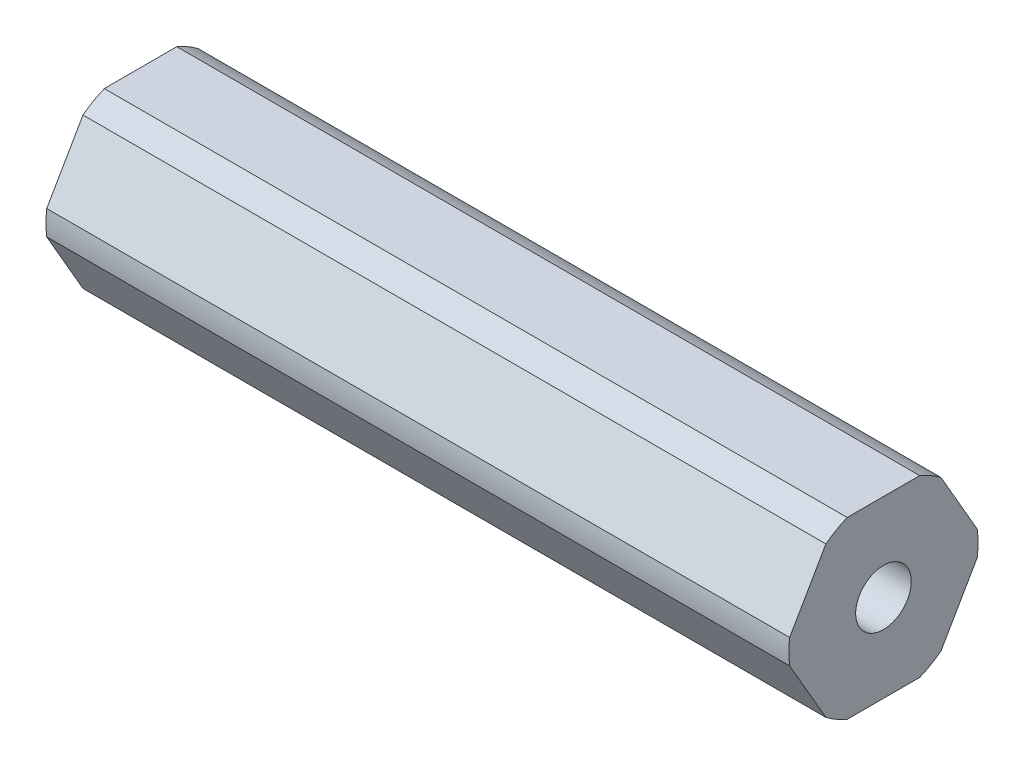
ISO-10303-21;
HEADER;
FILE_DESCRIPTION(('STEP AP214'),'2;1');
FILE_NAME('part.step','',(''),(''),'','','');
FILE_SCHEMA(('AUTOMOTIVE_DESIGN { 1 0 10303 214 1 1 1 1 }'));
ENDSEC;
DATA;
#1=APPLICATION_CONTEXT('core data for automotive mechanical design processes');
#2=APPLICATION_PROTOCOL_DEFINITION('international standard','automotive_design',2000,#1);
#3=PRODUCT_CONTEXT('',#1,'mechanical');
#4=PRODUCT('Part','Part','',(#3));
#5=PRODUCT_RELATED_PRODUCT_CATEGORY('part','',(#4));
#6=PRODUCT_DEFINITION_FORMATION('','',#4);
#7=PRODUCT_DEFINITION_CONTEXT('part definition',#1,'design');
#8=PRODUCT_DEFINITION('design','',#6,#7);
#9=PRODUCT_DEFINITION_SHAPE('','',#8);
#10=(LENGTH_UNIT() NAMED_UNIT(*) SI_UNIT(.MILLI.,.METRE.));
#11=(NAMED_UNIT(*) PLANE_ANGLE_UNIT() SI_UNIT($,.RADIAN.));
#12=(NAMED_UNIT(*) SI_UNIT($,.STERADIAN.) SOLID_ANGLE_UNIT());
#13=UNCERTAINTY_MEASURE_WITH_UNIT(LENGTH_MEASURE(1.E-05),#10,'distance_accuracy_value','');
#14=(GEOMETRIC_REPRESENTATION_CONTEXT(3) GLOBAL_UNCERTAINTY_ASSIGNED_CONTEXT((#13)) GLOBAL_UNIT_ASSIGNED_CONTEXT((#10,
#11,#12)) REPRESENTATION_CONTEXT('',''));
#15=CARTESIAN_POINT('',(0.,0.,0.));
#16=DIRECTION('',(0.,0.,1.));
#17=DIRECTION('',(1.,0.,0.));
#18=AXIS2_PLACEMENT_3D('',#15,#16,#17);
#19=CARTESIAN_POINT('',(26.9875,3.17499999999999,-5.49926131403116));
#20=DIRECTION('',(0.,-0.500000000000001,0.866025403784438));
#21=DIRECTION('',(0.,-0.866025403784438,-0.500000000000001));
#22=AXIS2_PLACEMENT_3D('',#19,#20,#21);
#23=PLANE('',#22);
#24=DIRECTION('',(0.,0.866025403784438,0.500000000000001));
#25=VECTOR('',#24,1.);
#26=CARTESIAN_POINT('',(-26.9875,3.17499999999999,-5.49926131403116));
#27=LINE('',#26,#25);
#28=CARTESIAN_POINT('',(-26.9875,0.89303957103212,-6.81675178197584));
#29=VERTEX_POINT('',#28);
#30=CARTESIAN_POINT('',(-26.9875,5.45696042896787,-4.18177084608648));
#31=VERTEX_POINT('',#30);
#32=EDGE_CURVE('E161',#29,#31,#27,.T.);
#33=ORIENTED_EDGE('',*,*,#32,.T.);
#34=DIRECTION('',(-1.,0.,0.));
#35=VECTOR('',#34,1.);
#36=CARTESIAN_POINT('',(26.9875,5.45696042896787,-4.18177084608648));
#37=LINE('',#36,#35);
#38=CARTESIAN_POINT('',(26.9875,5.45696042896787,-4.18177084608648));
#39=VERTEX_POINT('',#38);
#40=EDGE_CURVE('E11',#39,#31,#37,.T.);
#41=ORIENTED_EDGE('',*,*,#40,.F.);
#42=DIRECTION('',(0.,0.866025403784438,0.500000000000001));
#43=VECTOR('',#42,1.);
#44=CARTESIAN_POINT('',(26.9875,3.17499999999999,-5.49926131403116));
#45=LINE('',#44,#43);
#46=CARTESIAN_POINT('',(26.9875,0.89303957103212,-6.81675178197584));
#47=VERTEX_POINT('',#46);
#48=EDGE_CURVE('E220',#47,#39,#45,.T.);
#49=ORIENTED_EDGE('',*,*,#48,.F.);
#50=DIRECTION('',(-1.,0.,0.));
#51=VECTOR('',#50,1.);
#52=CARTESIAN_POINT('',(26.9875,0.89303957103212,-6.81675178197584));
#53=LINE('',#52,#51);
#54=EDGE_CURVE('E154',#47,#29,#53,.T.);
#55=ORIENTED_EDGE('',*,*,#54,.T.);
#56=EDGE_LOOP('',(#33,#41,#49,#55));
#57=FACE_BOUND('',#56,.T.);
#58=ADVANCED_FACE('F36',(#57),#23,.F.);
#59=CARTESIAN_POINT('',(26.9875,0.,0.));
#60=DIRECTION('',(-1.,0.,0.));
#61=DIRECTION('',(0.,0.,1.));
#62=AXIS2_PLACEMENT_3D('',#59,#60,#61);
#63=CYLINDRICAL_SURFACE('',#62,6.874999966);
#64=CARTESIAN_POINT('',(-26.9875,0.,0.));
#65=DIRECTION('',(1.,0.,0.));
#66=DIRECTION('',(0.,0.,-1.));
#67=AXIS2_PLACEMENT_3D('',#64,#65,#66);
#68=CIRCLE('',#67,6.874999966);
#69=CARTESIAN_POINT('',(-26.9875,6.34999999999998,-2.63498093588933));
#70=VERTEX_POINT('',#69);
#71=EDGE_CURVE('E164',#31,#70,#68,.T.);
#72=ORIENTED_EDGE('',*,*,#71,.T.);
#73=DIRECTION('',(-1.,0.,0.));
#74=VECTOR('',#73,1.);
#75=CARTESIAN_POINT('',(26.9875,6.34999999999998,-2.63498093588933));
#76=LINE('',#75,#74);
#77=CARTESIAN_POINT('',(26.9875,6.34999999999998,-2.63498093588933));
#78=VERTEX_POINT('',#77);
#79=EDGE_CURVE('E45',#78,#70,#76,.T.);
#80=ORIENTED_EDGE('',*,*,#79,.F.);
#81=CARTESIAN_POINT('',(26.9875,0.,0.));
#82=DIRECTION('',(1.,0.,0.));
#83=DIRECTION('',(0.,0.,-1.));
#84=AXIS2_PLACEMENT_3D('',#81,#82,#83);
#85=CIRCLE('',#84,6.874999966);
#86=EDGE_CURVE('E108',#39,#78,#85,.T.);
#87=ORIENTED_EDGE('',*,*,#86,.F.);
#88=ORIENTED_EDGE('',*,*,#40,.T.);
#89=EDGE_LOOP('',(#72,#80,#87,#88));
#90=FACE_BOUND('',#89,.T.);
#91=ADVANCED_FACE('F255',(#90),#63,.T.);
#92=CARTESIAN_POINT('',(26.9875,6.34999999999997,0.));
#93=DIRECTION('',(0.,-1.,0.));
#94=DIRECTION('',(0.,0.,-1.));
#95=AXIS2_PLACEMENT_3D('',#92,#93,#94);
#96=PLANE('',#95);
#97=DIRECTION('',(0.,0.,1.));
#98=VECTOR('',#97,1.);
#99=CARTESIAN_POINT('',(-26.9875,6.34999999999997,0.));
#100=LINE('',#99,#98);
#101=CARTESIAN_POINT('',(-26.9875,6.34999999999997,2.63498093588938));
#102=VERTEX_POINT('',#101);
#103=EDGE_CURVE('E166',#70,#102,#100,.T.);
#104=ORIENTED_EDGE('',*,*,#103,.T.);
#105=DIRECTION('',(-1.,0.,0.));
#106=VECTOR('',#105,1.);
#107=CARTESIAN_POINT('',(26.9875,6.34999999999997,2.63498093588938));
#108=LINE('',#107,#106);
#109=CARTESIAN_POINT('',(26.9875,6.34999999999997,2.63498093588938));
#110=VERTEX_POINT('',#109);
#111=EDGE_CURVE('E196',#110,#102,#108,.T.);
#112=ORIENTED_EDGE('',*,*,#111,.F.);
#113=DIRECTION('',(0.,0.,1.));
#114=VECTOR('',#113,1.);
#115=CARTESIAN_POINT('',(26.9875,6.34999999999997,0.));
#116=LINE('',#115,#114);
#117=EDGE_CURVE('E204',#78,#110,#116,.T.);
#118=ORIENTED_EDGE('',*,*,#117,.F.);
#119=ORIENTED_EDGE('',*,*,#79,.T.);
#120=EDGE_LOOP('',(#104,#112,#118,#119));
#121=FACE_BOUND('',#120,.T.);
#122=ADVANCED_FACE('F202',(#121),#96,.F.);
#123=CARTESIAN_POINT('',(-26.9875,5.45696042896784,4.18177084608651));
#124=VERTEX_POINT('',#123);
#125=EDGE_CURVE('E167',#102,#124,#68,.T.);
#126=ORIENTED_EDGE('',*,*,#125,.T.);
#127=DIRECTION('',(-1.,0.,0.));
#128=VECTOR('',#127,1.);
#129=CARTESIAN_POINT('',(26.9875,5.45696042896784,4.18177084608651));
#130=LINE('',#129,#128);
#131=CARTESIAN_POINT('',(26.9875,5.45696042896784,4.18177084608651));
#132=VERTEX_POINT('',#131);
#133=EDGE_CURVE('E193',#132,#124,#130,.T.);
#134=ORIENTED_EDGE('',*,*,#133,.F.);
#135=EDGE_CURVE('E226',#110,#132,#85,.T.);
#136=ORIENTED_EDGE('',*,*,#135,.F.);
#137=ORIENTED_EDGE('',*,*,#111,.T.);
#138=EDGE_LOOP('',(#126,#134,#136,#137));
#139=FACE_BOUND('',#138,.T.);
#140=ADVANCED_FACE('F237',(#139),#63,.T.);
#141=CARTESIAN_POINT('',(26.9875,3.17499999999995,5.49926131403118));
#142=DIRECTION('',(0.,-0.499999999999995,-0.866025403784442));
#143=DIRECTION('',(0.,0.866025403784442,-0.499999999999995));
#144=AXIS2_PLACEMENT_3D('',#141,#142,#143);
#145=PLANE('',#144);
#146=DIRECTION('',(0.,-0.866025403784442,0.499999999999995));
#147=VECTOR('',#146,1.);
#148=CARTESIAN_POINT('',(-26.9875,3.17499999999995,5.49926131403118));
#149=LINE('',#148,#147);
#150=CARTESIAN_POINT('',(-26.9875,0.893039571032066,6.81675178197585));
#151=VERTEX_POINT('',#150);
#152=EDGE_CURVE('E169',#124,#151,#149,.T.);
#153=ORIENTED_EDGE('',*,*,#152,.T.);
#154=DIRECTION('',(-1.,0.,0.));
#155=VECTOR('',#154,1.);
#156=CARTESIAN_POINT('',(26.9875,0.893039571032066,6.81675178197585));
#157=LINE('',#156,#155);
#158=CARTESIAN_POINT('',(26.9875,0.893039571032066,6.81675178197585));
#159=VERTEX_POINT('',#158);
#160=EDGE_CURVE('E190',#159,#151,#157,.T.);
#161=ORIENTED_EDGE('',*,*,#160,.F.);
#162=DIRECTION('',(0.,-0.866025403784442,0.499999999999995));
#163=VECTOR('',#162,1.);
#164=CARTESIAN_POINT('',(26.9875,3.17499999999995,5.49926131403118));
#165=LINE('',#164,#163);
#166=EDGE_CURVE('E228',#132,#159,#165,.T.);
#167=ORIENTED_EDGE('',*,*,#166,.F.);
#168=ORIENTED_EDGE('',*,*,#133,.T.);
#169=EDGE_LOOP('',(#153,#161,#167,#168));
#170=FACE_BOUND('',#169,.T.);
#171=ADVANCED_FACE('F239',(#170),#145,.F.);
#172=CARTESIAN_POINT('',(-26.9875,-0.893039571032163,6.81675178197583));
#173=VERTEX_POINT('',#172);
#174=EDGE_CURVE('E171',#151,#173,#68,.T.);
#175=ORIENTED_EDGE('',*,*,#174,.T.);
#176=DIRECTION('',(-1.,0.,0.));
#177=VECTOR('',#176,1.);
#178=CARTESIAN_POINT('',(26.9875,-0.893039571032163,6.81675178197583));
#179=LINE('',#178,#177);
#180=CARTESIAN_POINT('',(26.9875,-0.893039571032163,6.81675178197583));
#181=VERTEX_POINT('',#180);
#182=EDGE_CURVE('E187',#181,#173,#179,.T.);
#183=ORIENTED_EDGE('',*,*,#182,.F.);
#184=EDGE_CURVE('E229',#159,#181,#85,.T.);
#185=ORIENTED_EDGE('',*,*,#184,.F.);
#186=ORIENTED_EDGE('',*,*,#160,.T.);
#187=EDGE_LOOP('',(#175,#183,#185,#186));
#188=FACE_BOUND('',#187,.T.);
#189=ADVANCED_FACE('F240',(#188),#63,.T.);
#190=CARTESIAN_POINT('',(26.9875,-3.17500000000003,5.49926131403114));
#191=DIRECTION('',(0.,0.500000000000007,-0.866025403784435));
#192=DIRECTION('',(0.,0.866025403784435,0.500000000000007));
#193=AXIS2_PLACEMENT_3D('',#190,#191,#192);
#194=PLANE('',#193);
#195=DIRECTION('',(0.,-0.866025403784435,-0.500000000000007));
#196=VECTOR('',#195,1.);
#197=CARTESIAN_POINT('',(-26.9875,-3.17500000000003,5.49926131403114));
#198=LINE('',#197,#196);
#199=CARTESIAN_POINT('',(-26.9875,-5.4569604289679,4.18177084608644));
#200=VERTEX_POINT('',#199);
#201=EDGE_CURVE('E172',#173,#200,#198,.T.);
#202=ORIENTED_EDGE('',*,*,#201,.T.);
#203=DIRECTION('',(-1.,0.,0.));
#204=VECTOR('',#203,1.);
#205=CARTESIAN_POINT('',(26.9875,-5.4569604289679,4.18177084608644));
#206=LINE('',#205,#204);
#207=CARTESIAN_POINT('',(26.9875,-5.4569604289679,4.18177084608644));
#208=VERTEX_POINT('',#207);
#209=EDGE_CURVE('E184',#208,#200,#206,.T.);
#210=ORIENTED_EDGE('',*,*,#209,.F.);
#211=DIRECTION('',(0.,-0.866025403784435,-0.500000000000007));
#212=VECTOR('',#211,1.);
#213=CARTESIAN_POINT('',(26.9875,-3.17500000000003,5.49926131403114));
#214=LINE('',#213,#212);
#215=EDGE_CURVE('E230',#181,#208,#214,.T.);
#216=ORIENTED_EDGE('',*,*,#215,.F.);
#217=ORIENTED_EDGE('',*,*,#182,.T.);
#218=EDGE_LOOP('',(#202,#210,#216,#217));
#219=FACE_BOUND('',#218,.T.);
#220=ADVANCED_FACE('F243',(#219),#194,.F.);
#221=CARTESIAN_POINT('',(-26.9875,-6.35,2.63498093588929));
#222=VERTEX_POINT('',#221);
#223=EDGE_CURVE('E174',#200,#222,#68,.T.);
#224=ORIENTED_EDGE('',*,*,#223,.T.);
#225=DIRECTION('',(-1.,0.,0.));
#226=VECTOR('',#225,1.);
#227=CARTESIAN_POINT('',(26.9875,-6.35,2.63498093588929));
#228=LINE('',#227,#226);
#229=CARTESIAN_POINT('',(26.9875,-6.35,2.63498093588929));
#230=VERTEX_POINT('',#229);
#231=EDGE_CURVE('E181',#230,#222,#228,.T.);
#232=ORIENTED_EDGE('',*,*,#231,.F.);
#233=EDGE_CURVE('E144',#208,#230,#85,.T.);
#234=ORIENTED_EDGE('',*,*,#233,.F.);
#235=ORIENTED_EDGE('',*,*,#209,.T.);
#236=EDGE_LOOP('',(#224,#232,#234,#235));
#237=FACE_BOUND('',#236,.T.);
#238=ADVANCED_FACE('F245',(#237),#63,.T.);
#239=CARTESIAN_POINT('',(26.9875,-6.34999999999997,0.));
#240=DIRECTION('',(0.,1.,0.));
#241=DIRECTION('',(0.,0.,1.));
#242=AXIS2_PLACEMENT_3D('',#239,#240,#241);
#243=PLANE('',#242);
#244=DIRECTION('',(0.,0.,-1.));
#245=VECTOR('',#244,1.);
#246=CARTESIAN_POINT('',(-26.9875,-6.34999999999997,0.));
#247=LINE('',#246,#245);
#248=CARTESIAN_POINT('',(-26.9875,-6.34999999999994,-2.63498093588942));
#249=VERTEX_POINT('',#248);
#250=EDGE_CURVE('E175',#222,#249,#247,.T.);
#251=ORIENTED_EDGE('',*,*,#250,.T.);
#252=DIRECTION('',(-1.,0.,0.));
#253=VECTOR('',#252,1.);
#254=CARTESIAN_POINT('',(26.9875,-6.34999999999994,-2.63498093588942));
#255=LINE('',#254,#253);
#256=CARTESIAN_POINT('',(26.9875,-6.34999999999994,-2.63498093588942));
#257=VERTEX_POINT('',#256);
#258=EDGE_CURVE('E149',#257,#249,#255,.T.);
#259=ORIENTED_EDGE('',*,*,#258,.F.);
#260=DIRECTION('',(0.,0.,-1.));
#261=VECTOR('',#260,1.);
#262=CARTESIAN_POINT('',(26.9875,-6.34999999999997,0.));
#263=LINE('',#262,#261);
#264=EDGE_CURVE('E139',#230,#257,#263,.T.);
#265=ORIENTED_EDGE('',*,*,#264,.F.);
#266=ORIENTED_EDGE('',*,*,#231,.T.);
#267=EDGE_LOOP('',(#251,#259,#265,#266));
#268=FACE_BOUND('',#267,.T.);
#269=ADVANCED_FACE('F248',(#268),#243,.F.);
#270=CARTESIAN_POINT('',(-26.9875,-5.4569604289678,-4.18177084608657));
#271=VERTEX_POINT('',#270);
#272=EDGE_CURVE('E148',#249,#271,#68,.T.);
#273=ORIENTED_EDGE('',*,*,#272,.T.);
#274=DIRECTION('',(-1.,0.,0.));
#275=VECTOR('',#274,1.);
#276=CARTESIAN_POINT('',(26.9875,-5.4569604289678,-4.18177084608657));
#277=LINE('',#276,#275);
#278=CARTESIAN_POINT('',(26.9875,-5.4569604289678,-4.18177084608657));
#279=VERTEX_POINT('',#278);
#280=EDGE_CURVE('E145',#279,#271,#277,.T.);
#281=ORIENTED_EDGE('',*,*,#280,.F.);
#282=EDGE_CURVE('E133',#257,#279,#85,.T.);
#283=ORIENTED_EDGE('',*,*,#282,.F.);
#284=ORIENTED_EDGE('',*,*,#258,.T.);
#285=EDGE_LOOP('',(#273,#281,#283,#284));
#286=FACE_BOUND('',#285,.T.);
#287=ADVANCED_FACE('F146',(#286),#63,.T.);
#288=CARTESIAN_POINT('',(26.9875,-3.17499999999997,-5.4992613140312));
#289=DIRECTION('',(0.,0.499999999999995,0.866025403784441));
#290=DIRECTION('',(0.,-0.866025403784441,0.499999999999995));
#291=AXIS2_PLACEMENT_3D('',#288,#289,#290);
#292=PLANE('',#291);
#293=DIRECTION('',(0.,0.866025403784441,-0.499999999999995));
#294=VECTOR('',#293,1.);
#295=CARTESIAN_POINT('',(-26.9875,-3.17499999999997,-5.4992613140312));
#296=LINE('',#295,#294);
#297=CARTESIAN_POINT('',(-26.9875,-0.893039571032135,-6.81675178197584));
#298=VERTEX_POINT('',#297);
#299=EDGE_CURVE('E94',#271,#298,#296,.T.);
#300=ORIENTED_EDGE('',*,*,#299,.T.);
#301=DIRECTION('',(-1.,0.,0.));
#302=VECTOR('',#301,1.);
#303=CARTESIAN_POINT('',(26.9875,-0.893039571032135,-6.81675178197584));
#304=LINE('',#303,#302);
#305=CARTESIAN_POINT('',(26.9875,-0.893039571032135,-6.81675178197584));
#306=VERTEX_POINT('',#305);
#307=EDGE_CURVE('E150',#306,#298,#304,.T.);
#308=ORIENTED_EDGE('',*,*,#307,.F.);
#309=DIRECTION('',(0.,0.866025403784441,-0.499999999999995));
#310=VECTOR('',#309,1.);
#311=CARTESIAN_POINT('',(26.9875,-3.17499999999997,-5.4992613140312));
#312=LINE('',#311,#310);
#313=EDGE_CURVE('E137',#279,#306,#312,.T.);
#314=ORIENTED_EDGE('',*,*,#313,.F.);
#315=ORIENTED_EDGE('',*,*,#280,.T.);
#316=EDGE_LOOP('',(#300,#308,#314,#315));
#317=FACE_BOUND('',#316,.T.);
#318=ADVANCED_FACE('F152',(#317),#292,.F.);
#319=CARTESIAN_POINT('',(26.9875,0.,0.));
#320=DIRECTION('',(-1.,0.,0.));
#321=DIRECTION('',(0.,0.,1.));
#322=AXIS2_PLACEMENT_3D('',#319,#320,#321);
#323=CYLINDRICAL_SURFACE('',#322,2.0193);
#324=CARTESIAN_POINT('',(26.9875,0.,0.));
#325=DIRECTION('',(1.,0.,0.));
#326=DIRECTION('',(0.,0.,-1.));
#327=AXIS2_PLACEMENT_3D('',#324,#325,#326);
#328=CIRCLE('',#327,2.0193);
#329=CARTESIAN_POINT('',(26.9875,0.,-2.0193));
#330=VERTEX_POINT('',#329);
#331=EDGE_CURVE('E218',#330,#330,#328,.T.);
#332=ORIENTED_EDGE('',*,*,#331,.T.);
#333=EDGE_LOOP('',(#332));
#334=FACE_BOUND('',#333,.T.);
#335=CARTESIAN_POINT('',(-26.9875,0.,0.));
#336=DIRECTION('',(1.,0.,0.));
#337=DIRECTION('',(0.,0.,-1.));
#338=AXIS2_PLACEMENT_3D('',#335,#336,#337);
#339=CIRCLE('',#338,2.0193);
#340=CARTESIAN_POINT('',(-26.9875,0.,-2.0193));
#341=VERTEX_POINT('',#340);
#342=EDGE_CURVE('E158',#341,#341,#339,.T.);
#343=ORIENTED_EDGE('',*,*,#342,.F.);
#344=EDGE_LOOP('',(#343));
#345=FACE_BOUND('',#344,.T.);
#346=ADVANCED_FACE('F38',(#334,#345),#323,.F.);
#347=EDGE_CURVE('E100',#298,#29,#68,.T.);
#348=ORIENTED_EDGE('',*,*,#347,.T.);
#349=ORIENTED_EDGE('',*,*,#54,.F.);
#350=EDGE_CURVE('E53',#306,#47,#85,.T.);
#351=ORIENTED_EDGE('',*,*,#350,.F.);
#352=ORIENTED_EDGE('',*,*,#307,.T.);
#353=EDGE_LOOP('',(#348,#349,#351,#352));
#354=FACE_BOUND('',#353,.T.);
#355=ADVANCED_FACE('F252',(#354),#63,.T.);
#356=CARTESIAN_POINT('',(26.9875,0.,0.));
#357=DIRECTION('',(1.,0.,0.));
#358=DIRECTION('',(0.,0.,-1.));
#359=AXIS2_PLACEMENT_3D('',#356,#357,#358);
#360=PLANE('',#359);
#361=ORIENTED_EDGE('',*,*,#331,.F.);
#362=EDGE_LOOP('',(#361));
#363=FACE_BOUND('',#362,.T.);
#364=ORIENTED_EDGE('',*,*,#48,.T.);
#365=ORIENTED_EDGE('',*,*,#86,.T.);
#366=ORIENTED_EDGE('',*,*,#117,.T.);
#367=ORIENTED_EDGE('',*,*,#135,.T.);
#368=ORIENTED_EDGE('',*,*,#166,.T.);
#369=ORIENTED_EDGE('',*,*,#184,.T.);
#370=ORIENTED_EDGE('',*,*,#215,.T.);
#371=ORIENTED_EDGE('',*,*,#233,.T.);
#372=ORIENTED_EDGE('',*,*,#264,.T.);
#373=ORIENTED_EDGE('',*,*,#282,.T.);
#374=ORIENTED_EDGE('',*,*,#313,.T.);
#375=ORIENTED_EDGE('',*,*,#350,.T.);
#376=EDGE_LOOP('',(#364,#365,#366,#367,#368,#369,#370,#371,#372,#373,#374,#375));
#377=FACE_BOUND('',#376,.T.);
#378=ADVANCED_FACE('F135',(#363,#377),#360,.T.);
#379=CARTESIAN_POINT('',(-26.9875,0.,0.));
#380=DIRECTION('',(1.,0.,0.));
#381=DIRECTION('',(0.,0.,-1.));
#382=AXIS2_PLACEMENT_3D('',#379,#380,#381);
#383=PLANE('',#382);
#384=ORIENTED_EDGE('',*,*,#342,.T.);
#385=EDGE_LOOP('',(#384));
#386=FACE_BOUND('',#385,.T.);
#387=ORIENTED_EDGE('',*,*,#32,.F.);
#388=ORIENTED_EDGE('',*,*,#347,.F.);
#389=ORIENTED_EDGE('',*,*,#299,.F.);
#390=ORIENTED_EDGE('',*,*,#272,.F.);
#391=ORIENTED_EDGE('',*,*,#250,.F.);
#392=ORIENTED_EDGE('',*,*,#223,.F.);
#393=ORIENTED_EDGE('',*,*,#201,.F.);
#394=ORIENTED_EDGE('',*,*,#174,.F.);
#395=ORIENTED_EDGE('',*,*,#152,.F.);
#396=ORIENTED_EDGE('',*,*,#125,.F.);
#397=ORIENTED_EDGE('',*,*,#103,.F.);
#398=ORIENTED_EDGE('',*,*,#71,.F.);
#399=EDGE_LOOP('',(#387,#388,#389,#390,#391,#392,#393,#394,#395,#396,#397,#398));
#400=FACE_BOUND('',#399,.T.);
#401=ADVANCED_FACE('F208',(#386,#400),#383,.F.);
#402=CLOSED_SHELL('',(#58,#91,#122,#140,#171,#189,#220,#238,#269,#287,#318,#346,#355,#378,#401));
#403=MANIFOLD_SOLID_BREP('B2',#402);
#404=ADVANCED_BREP_SHAPE_REPRESENTATION('',(#18,#403),#14);
#405=SHAPE_DEFINITION_REPRESENTATION(#9,#404);
ENDSEC;
END-ISO-10303-21;
